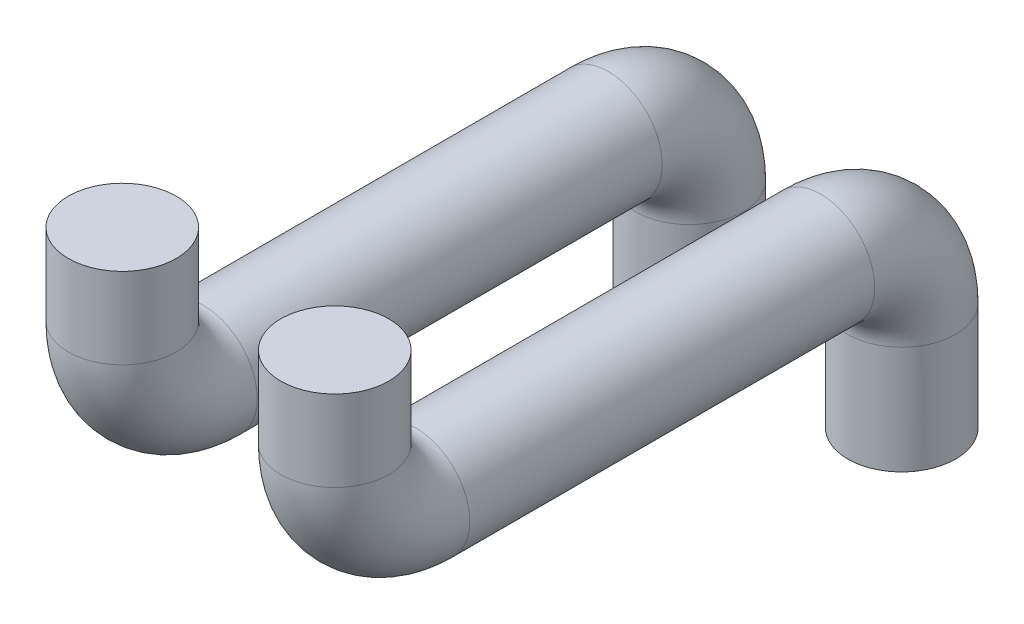
ISO-10303-21;
HEADER;
FILE_DESCRIPTION(('STEP AP214'),'2;1');
FILE_NAME('part.step','',(''),(''),'','','');
FILE_SCHEMA(('AUTOMOTIVE_DESIGN { 1 0 10303 214 1 1 1 1 }'));
ENDSEC;
DATA;
#1=APPLICATION_CONTEXT('core data for automotive mechanical design processes');
#2=APPLICATION_PROTOCOL_DEFINITION('international standard','automotive_design',2000,#1);
#3=PRODUCT_CONTEXT('',#1,'mechanical');
#4=PRODUCT('Part','Part','',(#3));
#5=PRODUCT_RELATED_PRODUCT_CATEGORY('part','',(#4));
#6=PRODUCT_DEFINITION_FORMATION('','',#4);
#7=PRODUCT_DEFINITION_CONTEXT('part definition',#1,'design');
#8=PRODUCT_DEFINITION('design','',#6,#7);
#9=PRODUCT_DEFINITION_SHAPE('','',#8);
#10=(LENGTH_UNIT() NAMED_UNIT(*) SI_UNIT(.MILLI.,.METRE.));
#11=(NAMED_UNIT(*) PLANE_ANGLE_UNIT() SI_UNIT($,.RADIAN.));
#12=(NAMED_UNIT(*) SI_UNIT($,.STERADIAN.) SOLID_ANGLE_UNIT());
#13=UNCERTAINTY_MEASURE_WITH_UNIT(LENGTH_MEASURE(1.E-05),#10,'distance_accuracy_value','');
#14=(GEOMETRIC_REPRESENTATION_CONTEXT(3) GLOBAL_UNCERTAINTY_ASSIGNED_CONTEXT((#13)) GLOBAL_UNIT_ASSIGNED_CONTEXT((#10,
#11,#12)) REPRESENTATION_CONTEXT('',''));
#15=CARTESIAN_POINT('',(0.,0.,0.));
#16=DIRECTION('',(0.,0.,1.));
#17=DIRECTION('',(1.,0.,0.));
#18=AXIS2_PLACEMENT_3D('',#15,#16,#17);
#19=CARTESIAN_POINT('',(-7.87,6.,10.5));
#20=DIRECTION('',(0.,1.,0.));
#21=DIRECTION('',(0.,0.,1.));
#22=AXIS2_PLACEMENT_3D('',#19,#20,#21);
#23=PLANE('',#22);
#24=CARTESIAN_POINT('',(-7.87,6.,10.5));
#25=DIRECTION('',(0.,-1.,0.));
#26=DIRECTION('',(0.,0.,1.));
#27=AXIS2_PLACEMENT_3D('',#24,#25,#26);
#28=CIRCLE('',#27,2.);
#29=CARTESIAN_POINT('',(-7.87,6.,12.5));
#30=VERTEX_POINT('',#29);
#31=EDGE_CURVE('E63',#30,#30,#28,.T.);
#32=ORIENTED_EDGE('',*,*,#31,.F.);
#33=EDGE_LOOP('',(#32));
#34=FACE_BOUND('',#33,.T.);
#35=ADVANCED_FACE('F41',(#34),#23,.T.);
#36=CARTESIAN_POINT('',(-7.87,-6.99999999999999,-10.5));
#37=DIRECTION('',(0.,1.,0.));
#38=DIRECTION('',(0.,0.,1.));
#39=AXIS2_PLACEMENT_3D('',#36,#37,#38);
#40=PLANE('',#39);
#41=CARTESIAN_POINT('',(-7.87,-6.99999999999999,-10.5));
#42=DIRECTION('',(0.,-1.,0.));
#43=DIRECTION('',(0.,0.,1.));
#44=AXIS2_PLACEMENT_3D('',#41,#42,#43);
#45=CIRCLE('',#44,2.);
#46=CARTESIAN_POINT('',(-7.87,-6.99999999999999,-8.50000000000001));
#47=VERTEX_POINT('',#46);
#48=EDGE_CURVE('E11',#47,#47,#45,.T.);
#49=ORIENTED_EDGE('',*,*,#48,.T.);
#50=EDGE_LOOP('',(#49));
#51=FACE_BOUND('',#50,.T.);
#52=ADVANCED_FACE('F70',(#51),#40,.F.);
#53=CARTESIAN_POINT('',(-7.87,6.,10.5));
#54=DIRECTION('',(0.,-1.,0.));
#55=DIRECTION('',(0.,0.,-1.));
#56=AXIS2_PLACEMENT_3D('',#53,#54,#55);
#57=CYLINDRICAL_SURFACE('',#56,2.);
#58=CARTESIAN_POINT('',(-7.87,3.,10.5));
#59=DIRECTION('',(0.,-1.,0.));
#60=DIRECTION('',(0.,0.,1.));
#61=AXIS2_PLACEMENT_3D('',#58,#59,#60);
#62=CIRCLE('',#61,2.);
#63=CARTESIAN_POINT('',(-7.87,3.,12.5));
#64=VERTEX_POINT('',#63);
#65=EDGE_CURVE('E60',#64,#64,#62,.T.);
#66=ORIENTED_EDGE('',*,*,#65,.F.);
#67=EDGE_LOOP('',(#66));
#68=FACE_BOUND('',#67,.T.);
#69=ORIENTED_EDGE('',*,*,#31,.T.);
#70=EDGE_LOOP('',(#69));
#71=FACE_BOUND('',#70,.T.);
#72=ADVANCED_FACE('F67',(#68,#71),#57,.T.);
#73=CARTESIAN_POINT('',(-7.87,3.,7.5));
#74=DIRECTION('',(-1.,0.,0.));
#75=DIRECTION('',(0.,0.,-1.));
#76=AXIS2_PLACEMENT_3D('',#73,#74,#75);
#77=TOROIDAL_SURFACE('',#76,3.,2.);
#78=CARTESIAN_POINT('',(-7.87,0.,7.5));
#79=DIRECTION('',(0.,0.,-1.));
#80=DIRECTION('',(0.,-1.,0.));
#81=AXIS2_PLACEMENT_3D('',#78,#79,#80);
#82=CIRCLE('',#81,2.);
#83=CARTESIAN_POINT('',(-7.87,-2.,7.5));
#84=VERTEX_POINT('',#83);
#85=EDGE_CURVE('E55',#84,#84,#82,.T.);
#86=CARTESIAN_POINT('',(-7.87,3.,7.5));
#87=DIRECTION('',(-1.,0.,0.));
#88=DIRECTION('',(0.,0.,-1.));
#89=AXIS2_PLACEMENT_3D('',#86,#87,#88);
#90=CIRCLE('',#89,5.);
#91=EDGE_CURVE('',#84,#64,#90,.T.);
#92=ORIENTED_EDGE('',*,*,#85,.F.);
#93=ORIENTED_EDGE('',*,*,#65,.T.);
#94=ORIENTED_EDGE('',*,*,#91,.T.);
#95=ORIENTED_EDGE('',*,*,#91,.F.);
#96=EDGE_LOOP('',(#92,#94,#93,#95));
#97=FACE_BOUND('',#96,.T.);
#98=ADVANCED_FACE('F77',(#97),#77,.T.);
#99=CARTESIAN_POINT('',(-7.87,0.,7.5));
#100=DIRECTION('',(0.,0.,-1.));
#101=DIRECTION('',(0.,1.,0.));
#102=AXIS2_PLACEMENT_3D('',#99,#100,#101);
#103=CYLINDRICAL_SURFACE('',#102,2.);
#104=CARTESIAN_POINT('',(-7.87,0.,-7.5));
#105=DIRECTION('',(0.,0.,-1.));
#106=DIRECTION('',(0.,-1.,0.));
#107=AXIS2_PLACEMENT_3D('',#104,#105,#106);
#108=CIRCLE('',#107,2.);
#109=CARTESIAN_POINT('',(-7.87,2.,-7.5));
#110=VERTEX_POINT('',#109);
#111=EDGE_CURVE('E51',#110,#110,#108,.T.);
#112=ORIENTED_EDGE('',*,*,#111,.F.);
#113=EDGE_LOOP('',(#112));
#114=FACE_BOUND('',#113,.T.);
#115=ORIENTED_EDGE('',*,*,#85,.T.);
#116=EDGE_LOOP('',(#115));
#117=FACE_BOUND('',#116,.T.);
#118=ADVANCED_FACE('F88',(#114,#117),#103,.T.);
#119=CARTESIAN_POINT('',(-7.87,-3.,-7.5));
#120=DIRECTION('',(1.,0.,0.));
#121=DIRECTION('',(0.,0.,1.));
#122=AXIS2_PLACEMENT_3D('',#119,#120,#121);
#123=TOROIDAL_SURFACE('',#122,3.,2.);
#124=CARTESIAN_POINT('',(-7.87,-3.,-10.5));
#125=DIRECTION('',(0.,-1.,0.));
#126=DIRECTION('',(0.,0.,1.));
#127=AXIS2_PLACEMENT_3D('',#124,#125,#126);
#128=CIRCLE('',#127,2.);
#129=CARTESIAN_POINT('',(-7.87,-3.,-12.5));
#130=VERTEX_POINT('',#129);
#131=EDGE_CURVE('E47',#130,#130,#128,.T.);
#132=CARTESIAN_POINT('',(-7.87,-3.,-7.5));
#133=DIRECTION('',(1.,0.,0.));
#134=DIRECTION('',(0.,0.,1.));
#135=AXIS2_PLACEMENT_3D('',#132,#133,#134);
#136=CIRCLE('',#135,5.);
#137=EDGE_CURVE('',#130,#110,#136,.T.);
#138=ORIENTED_EDGE('',*,*,#131,.F.);
#139=ORIENTED_EDGE('',*,*,#111,.T.);
#140=ORIENTED_EDGE('',*,*,#137,.T.);
#141=ORIENTED_EDGE('',*,*,#137,.F.);
#142=EDGE_LOOP('',(#138,#140,#139,#141));
#143=FACE_BOUND('',#142,.T.);
#144=ADVANCED_FACE('F84',(#143),#123,.T.);
#145=CARTESIAN_POINT('',(-7.87,-2.99999999999999,-10.5));
#146=DIRECTION('',(0.,-1.,0.));
#147=DIRECTION('',(0.,0.,-1.));
#148=AXIS2_PLACEMENT_3D('',#145,#146,#147);
#149=CYLINDRICAL_SURFACE('',#148,2.);
#150=ORIENTED_EDGE('',*,*,#48,.F.);
#151=EDGE_LOOP('',(#150));
#152=FACE_BOUND('',#151,.T.);
#153=ORIENTED_EDGE('',*,*,#131,.T.);
#154=EDGE_LOOP('',(#153));
#155=FACE_BOUND('',#154,.T.);
#156=ADVANCED_FACE('F81',(#152,#155),#149,.T.);
#157=CLOSED_SHELL('',(#35,#52,#72,#98,#118,#144,#156));
#158=MANIFOLD_SOLID_BREP('B2',#157);
#159=CARTESIAN_POINT('',(0.,6.,10.5));
#160=DIRECTION('',(0.,1.,0.));
#161=DIRECTION('',(0.,0.,1.));
#162=AXIS2_PLACEMENT_3D('',#159,#160,#161);
#163=PLANE('',#162);
#164=CARTESIAN_POINT('',(0.,6.,10.5));
#165=DIRECTION('',(0.,1.,0.));
#166=DIRECTION('',(0.,0.,1.));
#167=AXIS2_PLACEMENT_3D('',#164,#165,#166);
#168=CIRCLE('',#167,2.);
#169=CARTESIAN_POINT('',(0.,6.,12.5));
#170=VERTEX_POINT('',#169);
#171=EDGE_CURVE('E188',#170,#170,#168,.T.);
#172=ORIENTED_EDGE('',*,*,#171,.T.);
#173=EDGE_LOOP('',(#172));
#174=FACE_BOUND('',#173,.T.);
#175=ADVANCED_FACE('F166',(#174),#163,.T.);
#176=CARTESIAN_POINT('',(0.,-6.99999999999999,-10.5));
#177=DIRECTION('',(0.,1.,0.));
#178=DIRECTION('',(0.,0.,1.));
#179=AXIS2_PLACEMENT_3D('',#176,#177,#178);
#180=PLANE('',#179);
#181=CARTESIAN_POINT('',(0.,-6.99999999999999,-10.5));
#182=DIRECTION('',(0.,1.,0.));
#183=DIRECTION('',(0.,0.,1.));
#184=AXIS2_PLACEMENT_3D('',#181,#182,#183);
#185=CIRCLE('',#184,2.);
#186=CARTESIAN_POINT('',(0.,-6.99999999999999,-8.50000000000001));
#187=VERTEX_POINT('',#186);
#188=EDGE_CURVE('E40',#187,#187,#185,.T.);
#189=ORIENTED_EDGE('',*,*,#188,.F.);
#190=EDGE_LOOP('',(#189));
#191=FACE_BOUND('',#190,.T.);
#192=ADVANCED_FACE('F196',(#191),#180,.F.);
#193=CARTESIAN_POINT('',(0.,6.,10.5));
#194=DIRECTION('',(0.,-1.,0.));
#195=DIRECTION('',(0.,0.,-1.));
#196=AXIS2_PLACEMENT_3D('',#193,#194,#195);
#197=CYLINDRICAL_SURFACE('',#196,2.);
#198=CARTESIAN_POINT('',(0.,3.,10.5));
#199=DIRECTION('',(0.,1.,0.));
#200=DIRECTION('',(0.,0.,1.));
#201=AXIS2_PLACEMENT_3D('',#198,#199,#200);
#202=CIRCLE('',#201,2.);
#203=CARTESIAN_POINT('',(0.,3.,12.5));
#204=VERTEX_POINT('',#203);
#205=EDGE_CURVE('E185',#204,#204,#202,.T.);
#206=ORIENTED_EDGE('',*,*,#205,.T.);
#207=EDGE_LOOP('',(#206));
#208=FACE_BOUND('',#207,.T.);
#209=ORIENTED_EDGE('',*,*,#171,.F.);
#210=EDGE_LOOP('',(#209));
#211=FACE_BOUND('',#210,.T.);
#212=ADVANCED_FACE('F193',(#208,#211),#197,.T.);
#213=CARTESIAN_POINT('',(0.,3.,7.5));
#214=DIRECTION('',(1.,0.,0.));
#215=DIRECTION('',(0.,0.,-1.));
#216=AXIS2_PLACEMENT_3D('',#213,#214,#215);
#217=TOROIDAL_SURFACE('',#216,3.,2.);
#218=CARTESIAN_POINT('',(0.,0.,7.5));
#219=DIRECTION('',(0.,0.,1.));
#220=DIRECTION('',(0.,-1.,0.));
#221=AXIS2_PLACEMENT_3D('',#218,#219,#220);
#222=CIRCLE('',#221,2.);
#223=CARTESIAN_POINT('',(0.,-2.,7.5));
#224=VERTEX_POINT('',#223);
#225=EDGE_CURVE('E180',#224,#224,#222,.T.);
#226=CARTESIAN_POINT('',(0.,3.,7.5));
#227=DIRECTION('',(1.,0.,0.));
#228=DIRECTION('',(0.,0.,-1.));
#229=AXIS2_PLACEMENT_3D('',#226,#227,#228);
#230=CIRCLE('',#229,5.);
#231=EDGE_CURVE('',#204,#224,#230,.T.);
#232=ORIENTED_EDGE('',*,*,#205,.F.);
#233=ORIENTED_EDGE('',*,*,#225,.T.);
#234=ORIENTED_EDGE('',*,*,#231,.T.);
#235=ORIENTED_EDGE('',*,*,#231,.F.);
#236=EDGE_LOOP('',(#232,#234,#233,#235));
#237=FACE_BOUND('',#236,.T.);
#238=ADVANCED_FACE('F195',(#237),#217,.T.);
#239=CARTESIAN_POINT('',(0.,0.,7.5));
#240=DIRECTION('',(0.,0.,-1.));
#241=DIRECTION('',(0.,1.,0.));
#242=AXIS2_PLACEMENT_3D('',#239,#240,#241);
#243=CYLINDRICAL_SURFACE('',#242,2.);
#244=CARTESIAN_POINT('',(0.,0.,-7.5));
#245=DIRECTION('',(0.,0.,1.));
#246=DIRECTION('',(0.,-1.,0.));
#247=AXIS2_PLACEMENT_3D('',#244,#245,#246);
#248=CIRCLE('',#247,2.);
#249=CARTESIAN_POINT('',(0.,2.,-7.5));
#250=VERTEX_POINT('',#249);
#251=EDGE_CURVE('E176',#250,#250,#248,.T.);
#252=ORIENTED_EDGE('',*,*,#251,.T.);
#253=EDGE_LOOP('',(#252));
#254=FACE_BOUND('',#253,.T.);
#255=ORIENTED_EDGE('',*,*,#225,.F.);
#256=EDGE_LOOP('',(#255));
#257=FACE_BOUND('',#256,.T.);
#258=ADVANCED_FACE('F203',(#254,#257),#243,.T.);
#259=CARTESIAN_POINT('',(0.,-3.,-7.5));
#260=DIRECTION('',(-1.,0.,0.));
#261=DIRECTION('',(0.,0.,1.));
#262=AXIS2_PLACEMENT_3D('',#259,#260,#261);
#263=TOROIDAL_SURFACE('',#262,3.,2.);
#264=CARTESIAN_POINT('',(0.,-3.,-10.5));
#265=DIRECTION('',(0.,1.,0.));
#266=DIRECTION('',(0.,0.,1.));
#267=AXIS2_PLACEMENT_3D('',#264,#265,#266);
#268=CIRCLE('',#267,2.);
#269=CARTESIAN_POINT('',(0.,-3.,-12.5));
#270=VERTEX_POINT('',#269);
#271=EDGE_CURVE('E172',#270,#270,#268,.T.);
#272=CARTESIAN_POINT('',(0.,-3.,-7.5));
#273=DIRECTION('',(-1.,0.,0.));
#274=DIRECTION('',(0.,0.,1.));
#275=AXIS2_PLACEMENT_3D('',#272,#273,#274);
#276=CIRCLE('',#275,5.);
#277=EDGE_CURVE('',#250,#270,#276,.T.);
#278=ORIENTED_EDGE('',*,*,#251,.F.);
#279=ORIENTED_EDGE('',*,*,#271,.T.);
#280=ORIENTED_EDGE('',*,*,#277,.T.);
#281=ORIENTED_EDGE('',*,*,#277,.F.);
#282=EDGE_LOOP('',(#278,#280,#279,#281));
#283=FACE_BOUND('',#282,.T.);
#284=ADVANCED_FACE('F209',(#283),#263,.T.);
#285=CARTESIAN_POINT('',(0.,-2.99999999999999,-10.5));
#286=DIRECTION('',(0.,-1.,0.));
#287=DIRECTION('',(0.,0.,-1.));
#288=AXIS2_PLACEMENT_3D('',#285,#286,#287);
#289=CYLINDRICAL_SURFACE('',#288,2.);
#290=ORIENTED_EDGE('',*,*,#188,.T.);
#291=EDGE_LOOP('',(#290));
#292=FACE_BOUND('',#291,.T.);
#293=ORIENTED_EDGE('',*,*,#271,.F.);
#294=EDGE_LOOP('',(#293));
#295=FACE_BOUND('',#294,.T.);
#296=ADVANCED_FACE('F207',(#292,#295),#289,.T.);
#297=CLOSED_SHELL('',(#175,#192,#212,#238,#258,#284,#296));
#298=MANIFOLD_SOLID_BREP('B6',#297);
#299=ADVANCED_BREP_SHAPE_REPRESENTATION('',(#18,#158,#298),#14);
#300=SHAPE_DEFINITION_REPRESENTATION(#9,#299);
ENDSEC;
END-ISO-10303-21;
